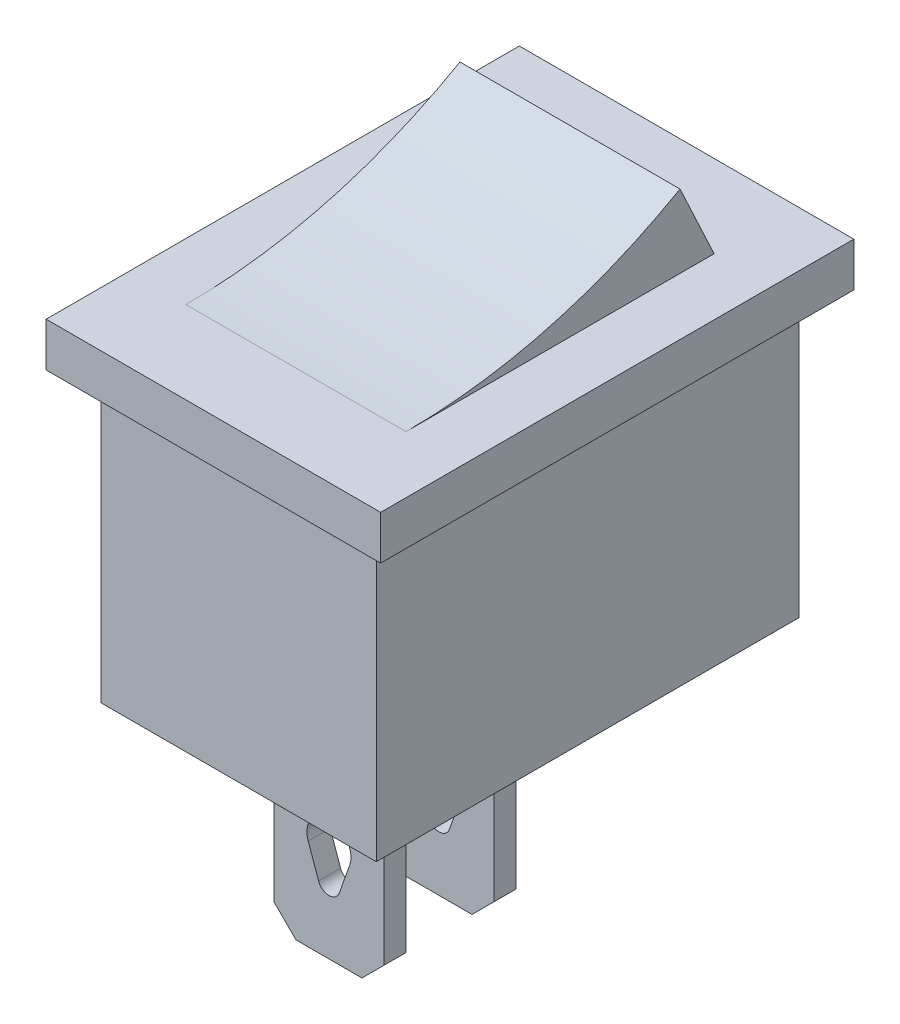
ISO-10303-21;
HEADER;
FILE_DESCRIPTION(('STEP AP214'),'2;1');
FILE_NAME('part.step','',(''),(''),'','','');
FILE_SCHEMA(('AUTOMOTIVE_DESIGN { 1 0 10303 214 1 1 1 1 }'));
ENDSEC;
DATA;
#1=APPLICATION_CONTEXT('core data for automotive mechanical design processes');
#2=APPLICATION_PROTOCOL_DEFINITION('international standard','automotive_design',2000,#1);
#3=PRODUCT_CONTEXT('',#1,'mechanical');
#4=PRODUCT('Part','Part','',(#3));
#5=PRODUCT_RELATED_PRODUCT_CATEGORY('part','',(#4));
#6=PRODUCT_DEFINITION_FORMATION('','',#4);
#7=PRODUCT_DEFINITION_CONTEXT('part definition',#1,'design');
#8=PRODUCT_DEFINITION('design','',#6,#7);
#9=PRODUCT_DEFINITION_SHAPE('','',#8);
#10=(LENGTH_UNIT() NAMED_UNIT(*) SI_UNIT(.MILLI.,.METRE.));
#11=(NAMED_UNIT(*) PLANE_ANGLE_UNIT() SI_UNIT($,.RADIAN.));
#12=(NAMED_UNIT(*) SI_UNIT($,.STERADIAN.) SOLID_ANGLE_UNIT());
#13=UNCERTAINTY_MEASURE_WITH_UNIT(LENGTH_MEASURE(1.E-05),#10,'distance_accuracy_value','');
#14=(GEOMETRIC_REPRESENTATION_CONTEXT(3) GLOBAL_UNCERTAINTY_ASSIGNED_CONTEXT((#13)) GLOBAL_UNIT_ASSIGNED_CONTEXT((#10,
#11,#12)) REPRESENTATION_CONTEXT('',''));
#15=CARTESIAN_POINT('',(0.,0.,0.));
#16=DIRECTION('',(0.,0.,1.));
#17=DIRECTION('',(1.,0.,0.));
#18=AXIS2_PLACEMENT_3D('',#15,#16,#17);
#19=CARTESIAN_POINT('',(0.,0.,0.));
#20=DIRECTION('',(0.,-1.,0.));
#21=DIRECTION('',(0.,0.,-1.));
#22=AXIS2_PLACEMENT_3D('',#19,#20,#21);
#23=PLANE('',#22);
#24=DIRECTION('',(0.,0.,-1.));
#25=VECTOR('',#24,1.);
#26=CARTESIAN_POINT('',(6.25,0.,9.6));
#27=LINE('',#26,#25);
#28=CARTESIAN_POINT('',(6.25,0.,9.6));
#29=VERTEX_POINT('',#28);
#30=CARTESIAN_POINT('',(6.25,0.,-9.6));
#31=VERTEX_POINT('',#30);
#32=EDGE_CURVE('E405',#29,#31,#27,.T.);
#33=ORIENTED_EDGE('',*,*,#32,.F.);
#34=DIRECTION('',(1.,0.,0.));
#35=VECTOR('',#34,1.);
#36=CARTESIAN_POINT('',(-6.25,0.,9.6));
#37=LINE('',#36,#35);
#38=CARTESIAN_POINT('',(-6.25,0.,9.6));
#39=VERTEX_POINT('',#38);
#40=EDGE_CURVE('E410',#39,#29,#37,.T.);
#41=ORIENTED_EDGE('',*,*,#40,.F.);
#42=DIRECTION('',(0.,0.,1.));
#43=VECTOR('',#42,1.);
#44=CARTESIAN_POINT('',(-6.25,0.,9.6));
#45=LINE('',#44,#43);
#46=CARTESIAN_POINT('',(-6.25,0.,-9.6));
#47=VERTEX_POINT('',#46);
#48=EDGE_CURVE('E424',#47,#39,#45,.T.);
#49=ORIENTED_EDGE('',*,*,#48,.F.);
#50=DIRECTION('',(-1.,0.,0.));
#51=VECTOR('',#50,1.);
#52=CARTESIAN_POINT('',(-6.25,0.,-9.6));
#53=LINE('',#52,#51);
#54=EDGE_CURVE('E422',#31,#47,#53,.T.);
#55=ORIENTED_EDGE('',*,*,#54,.F.);
#56=EDGE_LOOP('',(#33,#41,#49,#55));
#57=FACE_BOUND('',#56,.T.);
#58=DIRECTION('',(-1.,0.,0.));
#59=VECTOR('',#58,1.);
#60=CARTESIAN_POINT('',(-2.50000000000005,0.,5.5));
#61=LINE('',#60,#59);
#62=CARTESIAN_POINT('',(2.49999999999995,0.,5.5));
#63=VERTEX_POINT('',#62);
#64=CARTESIAN_POINT('',(-2.50000000000005,0.,5.5));
#65=VERTEX_POINT('',#64);
#66=EDGE_CURVE('E390',#63,#65,#61,.T.);
#67=ORIENTED_EDGE('',*,*,#66,.F.);
#68=DIRECTION('',(0.,0.,1.));
#69=VECTOR('',#68,1.);
#70=CARTESIAN_POINT('',(2.49999999999995,0.,4.5));
#71=LINE('',#70,#69);
#72=CARTESIAN_POINT('',(2.49999999999995,0.,4.5));
#73=VERTEX_POINT('',#72);
#74=EDGE_CURVE('E379',#73,#63,#71,.T.);
#75=ORIENTED_EDGE('',*,*,#74,.F.);
#76=DIRECTION('',(1.,0.,0.));
#77=VECTOR('',#76,1.);
#78=CARTESIAN_POINT('',(-2.50000000000005,0.,4.5));
#79=LINE('',#78,#77);
#80=CARTESIAN_POINT('',(-2.50000000000005,0.,4.5));
#81=VERTEX_POINT('',#80);
#82=EDGE_CURVE('E384',#81,#73,#79,.T.);
#83=ORIENTED_EDGE('',*,*,#82,.F.);
#84=DIRECTION('',(0.,0.,-1.));
#85=VECTOR('',#84,1.);
#86=CARTESIAN_POINT('',(-2.50000000000005,0.,4.5));
#87=LINE('',#86,#85);
#88=EDGE_CURVE('E393',#65,#81,#87,.T.);
#89=ORIENTED_EDGE('',*,*,#88,.F.);
#90=EDGE_LOOP('',(#67,#75,#83,#89));
#91=FACE_BOUND('',#90,.T.);
#92=DIRECTION('',(-1.,0.,0.));
#93=VECTOR('',#92,1.);
#94=CARTESIAN_POINT('',(-2.5,0.,0.500000000000001));
#95=LINE('',#94,#93);
#96=CARTESIAN_POINT('',(2.5,0.,0.500000000000001));
#97=VERTEX_POINT('',#96);
#98=CARTESIAN_POINT('',(-2.5,0.,0.500000000000001));
#99=VERTEX_POINT('',#98);
#100=EDGE_CURVE('E364',#97,#99,#95,.T.);
#101=ORIENTED_EDGE('',*,*,#100,.F.);
#102=DIRECTION('',(0.,0.,1.));
#103=VECTOR('',#102,1.);
#104=CARTESIAN_POINT('',(2.5,0.,-0.499999999999999));
#105=LINE('',#104,#103);
#106=CARTESIAN_POINT('',(2.5,0.,-0.499999999999999));
#107=VERTEX_POINT('',#106);
#108=EDGE_CURVE('E353',#107,#97,#105,.T.);
#109=ORIENTED_EDGE('',*,*,#108,.F.);
#110=DIRECTION('',(1.,0.,0.));
#111=VECTOR('',#110,1.);
#112=CARTESIAN_POINT('',(-2.5,0.,-0.5));
#113=LINE('',#112,#111);
#114=CARTESIAN_POINT('',(-2.5,0.,-0.5));
#115=VERTEX_POINT('',#114);
#116=EDGE_CURVE('E358',#115,#107,#113,.T.);
#117=ORIENTED_EDGE('',*,*,#116,.F.);
#118=DIRECTION('',(0.,0.,-1.));
#119=VECTOR('',#118,1.);
#120=CARTESIAN_POINT('',(-2.5,0.,-0.5));
#121=LINE('',#120,#119);
#122=EDGE_CURVE('E367',#99,#115,#121,.T.);
#123=ORIENTED_EDGE('',*,*,#122,.F.);
#124=EDGE_LOOP('',(#101,#109,#117,#123));
#125=FACE_BOUND('',#124,.T.);
#126=ADVANCED_FACE('F37',(#57,#91,#125),#23,.T.);
#127=CARTESIAN_POINT('',(6.25,13.,9.6));
#128=DIRECTION('',(-1.,0.,0.));
#129=DIRECTION('',(0.,0.,1.));
#130=AXIS2_PLACEMENT_3D('',#127,#128,#129);
#131=PLANE('',#130);
#132=ORIENTED_EDGE('',*,*,#32,.T.);
#133=DIRECTION('',(0.,-1.,0.));
#134=VECTOR('',#133,1.);
#135=CARTESIAN_POINT('',(6.25,13.,-9.6));
#136=LINE('',#135,#134);
#137=CARTESIAN_POINT('',(6.25,13.,-9.6));
#138=VERTEX_POINT('',#137);
#139=EDGE_CURVE('E435',#138,#31,#136,.T.);
#140=ORIENTED_EDGE('',*,*,#139,.F.);
#141=DIRECTION('',(0.,0.,-1.));
#142=VECTOR('',#141,1.);
#143=CARTESIAN_POINT('',(6.25,13.,9.6));
#144=LINE('',#143,#142);
#145=CARTESIAN_POINT('',(6.25,13.,9.6));
#146=VERTEX_POINT('',#145);
#147=EDGE_CURVE('E406',#146,#138,#144,.T.);
#148=ORIENTED_EDGE('',*,*,#147,.F.);
#149=DIRECTION('',(0.,-1.,0.));
#150=VECTOR('',#149,1.);
#151=CARTESIAN_POINT('',(6.25,13.,9.6));
#152=LINE('',#151,#150);
#153=EDGE_CURVE('E419',#146,#29,#152,.T.);
#154=ORIENTED_EDGE('',*,*,#153,.T.);
#155=EDGE_LOOP('',(#132,#140,#148,#154));
#156=FACE_BOUND('',#155,.T.);
#157=ADVANCED_FACE('F514',(#156),#131,.F.);
#158=CARTESIAN_POINT('',(-6.25,13.,-9.6));
#159=DIRECTION('',(0.,0.,1.));
#160=DIRECTION('',(1.,0.,0.));
#161=AXIS2_PLACEMENT_3D('',#158,#159,#160);
#162=PLANE('',#161);
#163=ORIENTED_EDGE('',*,*,#54,.T.);
#164=DIRECTION('',(0.,-1.,0.));
#165=VECTOR('',#164,1.);
#166=CARTESIAN_POINT('',(-6.25,13.,-9.6));
#167=LINE('',#166,#165);
#168=CARTESIAN_POINT('',(-6.25,13.,-9.6));
#169=VERTEX_POINT('',#168);
#170=EDGE_CURVE('E432',#169,#47,#167,.T.);
#171=ORIENTED_EDGE('',*,*,#170,.F.);
#172=DIRECTION('',(-1.,0.,0.));
#173=VECTOR('',#172,1.);
#174=CARTESIAN_POINT('',(-6.25,13.,-9.6));
#175=LINE('',#174,#173);
#176=EDGE_CURVE('E409',#138,#169,#175,.T.);
#177=ORIENTED_EDGE('',*,*,#176,.F.);
#178=ORIENTED_EDGE('',*,*,#139,.T.);
#179=EDGE_LOOP('',(#163,#171,#177,#178));
#180=FACE_BOUND('',#179,.T.);
#181=ADVANCED_FACE('F520',(#180),#162,.F.);
#182=CARTESIAN_POINT('',(-6.25,13.,9.6));
#183=DIRECTION('',(1.,0.,0.));
#184=DIRECTION('',(0.,0.,-1.));
#185=AXIS2_PLACEMENT_3D('',#182,#183,#184);
#186=PLANE('',#185);
#187=ORIENTED_EDGE('',*,*,#48,.T.);
#188=DIRECTION('',(0.,-1.,0.));
#189=VECTOR('',#188,1.);
#190=CARTESIAN_POINT('',(-6.25,13.,9.6));
#191=LINE('',#190,#189);
#192=CARTESIAN_POINT('',(-6.25,13.,9.6));
#193=VERTEX_POINT('',#192);
#194=EDGE_CURVE('E429',#193,#39,#191,.T.);
#195=ORIENTED_EDGE('',*,*,#194,.F.);
#196=DIRECTION('',(0.,0.,1.));
#197=VECTOR('',#196,1.);
#198=CARTESIAN_POINT('',(-6.25,13.,9.6));
#199=LINE('',#198,#197);
#200=EDGE_CURVE('E413',#169,#193,#199,.T.);
#201=ORIENTED_EDGE('',*,*,#200,.F.);
#202=ORIENTED_EDGE('',*,*,#170,.T.);
#203=EDGE_LOOP('',(#187,#195,#201,#202));
#204=FACE_BOUND('',#203,.T.);
#205=ADVANCED_FACE('F532',(#204),#186,.F.);
#206=CARTESIAN_POINT('',(-6.25,13.,9.6));
#207=DIRECTION('',(0.,0.,-1.));
#208=DIRECTION('',(-1.,0.,0.));
#209=AXIS2_PLACEMENT_3D('',#206,#207,#208);
#210=PLANE('',#209);
#211=ORIENTED_EDGE('',*,*,#40,.T.);
#212=ORIENTED_EDGE('',*,*,#153,.F.);
#213=DIRECTION('',(1.,0.,0.));
#214=VECTOR('',#213,1.);
#215=CARTESIAN_POINT('',(-6.25,13.,9.6));
#216=LINE('',#215,#214);
#217=EDGE_CURVE('E416',#193,#146,#216,.T.);
#218=ORIENTED_EDGE('',*,*,#217,.F.);
#219=ORIENTED_EDGE('',*,*,#194,.T.);
#220=EDGE_LOOP('',(#211,#212,#218,#219));
#221=FACE_BOUND('',#220,.T.);
#222=ADVANCED_FACE('F529',(#221),#210,.F.);
#223=CARTESIAN_POINT('',(2.49999999999995,-9.,4.5));
#224=DIRECTION('',(-1.,0.,0.));
#225=DIRECTION('',(0.,0.,1.));
#226=AXIS2_PLACEMENT_3D('',#223,#224,#225);
#227=PLANE('',#226);
#228=DIRECTION('',(0.,1.,0.));
#229=VECTOR('',#228,1.);
#230=CARTESIAN_POINT('',(2.49999999999995,-9.,5.5));
#231=LINE('',#230,#229);
#232=CARTESIAN_POINT('',(2.49999999999995,-8.,5.5));
#233=VERTEX_POINT('',#232);
#234=EDGE_CURVE('E403',#233,#63,#231,.T.);
#235=ORIENTED_EDGE('',*,*,#234,.F.);
#236=DIRECTION('',(0.,0.,-1.));
#237=VECTOR('',#236,1.);
#238=CARTESIAN_POINT('',(2.49999999999995,-8.,4.5));
#239=LINE('',#238,#237);
#240=CARTESIAN_POINT('',(2.49999999999995,-8.,4.5));
#241=VERTEX_POINT('',#240);
#242=EDGE_CURVE('E472',#233,#241,#239,.T.);
#243=ORIENTED_EDGE('',*,*,#242,.T.);
#244=DIRECTION('',(0.,1.,0.));
#245=VECTOR('',#244,1.);
#246=CARTESIAN_POINT('',(2.49999999999995,-9.,4.5));
#247=LINE('',#246,#245);
#248=EDGE_CURVE('E387',#241,#73,#247,.T.);
#249=ORIENTED_EDGE('',*,*,#248,.T.);
#250=ORIENTED_EDGE('',*,*,#74,.T.);
#251=EDGE_LOOP('',(#235,#243,#249,#250));
#252=FACE_BOUND('',#251,.T.);
#253=ADVANCED_FACE('F527',(#252),#227,.F.);
#254=CARTESIAN_POINT('',(-2.50000000000005,-9.,5.5));
#255=DIRECTION('',(0.,0.,-1.));
#256=DIRECTION('',(-1.,0.,0.));
#257=AXIS2_PLACEMENT_3D('',#254,#255,#256);
#258=PLANE('',#257);
#259=DIRECTION('',(-0.333333333333333,0.942809041582063,0.));
#260=VECTOR('',#259,1.);
#261=CARTESIAN_POINT('',(0.193626743013248,-8.04765913201493,5.5));
#262=LINE('',#261,#260);
#263=CARTESIAN_POINT('',(-0.471404520791032,-6.16666666666667,5.5));
#264=VERTEX_POINT('',#263);
#265=CARTESIAN_POINT('',(-0.942809041582064,-4.83333333333333,5.5));
#266=VERTEX_POINT('',#265);
#267=EDGE_CURVE('E341',#264,#266,#262,.T.);
#268=ORIENTED_EDGE('',*,*,#267,.T.);
#269=CARTESIAN_POINT('',(0.,-4.5,5.5));
#270=DIRECTION('',(0.,0.,-1.));
#271=DIRECTION('',(-1.,0.,0.));
#272=AXIS2_PLACEMENT_3D('',#269,#270,#271);
#273=CIRCLE('',#272,1.);
#274=CARTESIAN_POINT('',(0.942809041582063,-4.83333333333333,5.5));
#275=VERTEX_POINT('',#274);
#276=EDGE_CURVE('E350',#266,#275,#273,.T.);
#277=ORIENTED_EDGE('',*,*,#276,.T.);
#278=DIRECTION('',(-0.333333333333334,-0.942809041582063,0.));
#279=VECTOR('',#278,1.);
#280=CARTESIAN_POINT('',(-0.749182298568819,-9.61900753465173,5.5));
#281=LINE('',#280,#279);
#282=CARTESIAN_POINT('',(0.471404520791031,-6.16666666666667,5.5));
#283=VERTEX_POINT('',#282);
#284=EDGE_CURVE('E323',#275,#283,#281,.T.);
#285=ORIENTED_EDGE('',*,*,#284,.T.);
#286=CARTESIAN_POINT('',(0.,-6.,5.5));
#287=DIRECTION('',(0.,0.,-1.));
#288=DIRECTION('',(-1.,0.,0.));
#289=AXIS2_PLACEMENT_3D('',#286,#287,#288);
#290=CIRCLE('',#289,0.5);
#291=EDGE_CURVE('E332',#283,#264,#290,.T.);
#292=ORIENTED_EDGE('',*,*,#291,.T.);
#293=EDGE_LOOP('',(#268,#277,#285,#292));
#294=FACE_BOUND('',#293,.T.);
#295=DIRECTION('',(0.,1.,0.));
#296=VECTOR('',#295,1.);
#297=CARTESIAN_POINT('',(-2.50000000000005,-9.,5.5));
#298=LINE('',#297,#296);
#299=CARTESIAN_POINT('',(-2.50000000000005,-8.,5.5));
#300=VERTEX_POINT('',#299);
#301=EDGE_CURVE('E401',#300,#65,#298,.T.);
#302=ORIENTED_EDGE('',*,*,#301,.F.);
#303=DIRECTION('',(-0.707106781186548,0.707106781186548,0.));
#304=VECTOR('',#303,1.);
#305=CARTESIAN_POINT('',(-1.50000000000005,-9.,5.5));
#306=LINE('',#305,#304);
#307=CARTESIAN_POINT('',(-1.50000000000005,-9.,5.5));
#308=VERTEX_POINT('',#307);
#309=EDGE_CURVE('E470',#300,#308,#306,.F.);
#310=ORIENTED_EDGE('',*,*,#309,.T.);
#311=DIRECTION('',(-1.,0.,0.));
#312=VECTOR('',#311,1.);
#313=CARTESIAN_POINT('',(-2.50000000000005,-9.,5.5));
#314=LINE('',#313,#312);
#315=CARTESIAN_POINT('',(1.49999999999995,-9.,5.5));
#316=VERTEX_POINT('',#315);
#317=EDGE_CURVE('E380',#316,#308,#314,.T.);
#318=ORIENTED_EDGE('',*,*,#317,.F.);
#319=DIRECTION('',(-0.707106781186546,-0.707106781186549,0.));
#320=VECTOR('',#319,1.);
#321=CARTESIAN_POINT('',(1.49999999999995,-9.,5.5));
#322=LINE('',#321,#320);
#323=EDGE_CURVE('E468',#316,#233,#322,.F.);
#324=ORIENTED_EDGE('',*,*,#323,.T.);
#325=ORIENTED_EDGE('',*,*,#234,.T.);
#326=ORIENTED_EDGE('',*,*,#66,.T.);
#327=EDGE_LOOP('',(#302,#310,#318,#324,#325,#326));
#328=FACE_BOUND('',#327,.T.);
#329=ADVANCED_FACE('F567',(#294,#328),#258,.F.);
#330=CARTESIAN_POINT('',(-2.50000000000005,-9.,4.5));
#331=DIRECTION('',(1.,0.,0.));
#332=DIRECTION('',(0.,0.,-1.));
#333=AXIS2_PLACEMENT_3D('',#330,#331,#332);
#334=PLANE('',#333);
#335=DIRECTION('',(0.,1.,0.));
#336=VECTOR('',#335,1.);
#337=CARTESIAN_POINT('',(-2.50000000000005,-9.,4.5));
#338=LINE('',#337,#336);
#339=CARTESIAN_POINT('',(-2.50000000000005,-8.,4.5));
#340=VERTEX_POINT('',#339);
#341=EDGE_CURVE('E399',#340,#81,#338,.T.);
#342=ORIENTED_EDGE('',*,*,#341,.F.);
#343=DIRECTION('',(0.,0.,1.));
#344=VECTOR('',#343,1.);
#345=CARTESIAN_POINT('',(-2.50000000000005,-8.,4.5));
#346=LINE('',#345,#344);
#347=EDGE_CURVE('E466',#340,#300,#346,.T.);
#348=ORIENTED_EDGE('',*,*,#347,.T.);
#349=ORIENTED_EDGE('',*,*,#301,.T.);
#350=ORIENTED_EDGE('',*,*,#88,.T.);
#351=EDGE_LOOP('',(#342,#348,#349,#350));
#352=FACE_BOUND('',#351,.T.);
#353=ADVANCED_FACE('F584',(#352),#334,.F.);
#354=CARTESIAN_POINT('',(-2.50000000000005,-9.,4.5));
#355=DIRECTION('',(0.,0.,1.));
#356=DIRECTION('',(1.,0.,0.));
#357=AXIS2_PLACEMENT_3D('',#354,#355,#356);
#358=PLANE('',#357);
#359=DIRECTION('',(0.333333333333334,0.942809041582063,0.));
#360=VECTOR('',#359,1.);
#361=CARTESIAN_POINT('',(-0.749182298568819,-9.61900753465173,4.5));
#362=LINE('',#361,#360);
#363=CARTESIAN_POINT('',(0.471404520791031,-6.16666666666667,4.5));
#364=VERTEX_POINT('',#363);
#365=CARTESIAN_POINT('',(0.942809041582063,-4.83333333333333,4.5));
#366=VERTEX_POINT('',#365);
#367=EDGE_CURVE('E320',#364,#366,#362,.T.);
#368=ORIENTED_EDGE('',*,*,#367,.T.);
#369=CARTESIAN_POINT('',(0.,-4.5,4.5));
#370=DIRECTION('',(0.,0.,1.));
#371=DIRECTION('',(1.,0.,0.));
#372=AXIS2_PLACEMENT_3D('',#369,#370,#371);
#373=CIRCLE('',#372,1.);
#374=CARTESIAN_POINT('',(-0.942809041582063,-4.83333333333333,4.5));
#375=VERTEX_POINT('',#374);
#376=EDGE_CURVE('E347',#366,#375,#373,.T.);
#377=ORIENTED_EDGE('',*,*,#376,.T.);
#378=DIRECTION('',(0.333333333333333,-0.942809041582063,0.));
#379=VECTOR('',#378,1.);
#380=CARTESIAN_POINT('',(0.193626743013248,-8.04765913201493,4.5));
#381=LINE('',#380,#379);
#382=CARTESIAN_POINT('',(-0.471404520791032,-6.16666666666667,4.5));
#383=VERTEX_POINT('',#382);
#384=EDGE_CURVE('E338',#375,#383,#381,.T.);
#385=ORIENTED_EDGE('',*,*,#384,.T.);
#386=CARTESIAN_POINT('',(0.,-6.,4.5));
#387=DIRECTION('',(0.,0.,1.));
#388=DIRECTION('',(1.,0.,0.));
#389=AXIS2_PLACEMENT_3D('',#386,#387,#388);
#390=CIRCLE('',#389,0.5);
#391=EDGE_CURVE('E329',#383,#364,#390,.T.);
#392=ORIENTED_EDGE('',*,*,#391,.T.);
#393=EDGE_LOOP('',(#368,#377,#385,#392));
#394=FACE_BOUND('',#393,.T.);
#395=DIRECTION('',(1.,0.,0.));
#396=VECTOR('',#395,1.);
#397=CARTESIAN_POINT('',(-2.50000000000005,-9.,4.5));
#398=LINE('',#397,#396);
#399=CARTESIAN_POINT('',(-1.50000000000005,-9.,4.5));
#400=VERTEX_POINT('',#399);
#401=CARTESIAN_POINT('',(1.49999999999995,-9.,4.5));
#402=VERTEX_POINT('',#401);
#403=EDGE_CURVE('E383',#400,#402,#398,.T.);
#404=ORIENTED_EDGE('',*,*,#403,.F.);
#405=DIRECTION('',(0.707106781186548,-0.707106781186548,0.));
#406=VECTOR('',#405,1.);
#407=CARTESIAN_POINT('',(-1.50000000000005,-9.,4.5));
#408=LINE('',#407,#406);
#409=EDGE_CURVE('E464',#400,#340,#408,.F.);
#410=ORIENTED_EDGE('',*,*,#409,.T.);
#411=ORIENTED_EDGE('',*,*,#341,.T.);
#412=ORIENTED_EDGE('',*,*,#82,.T.);
#413=ORIENTED_EDGE('',*,*,#248,.F.);
#414=DIRECTION('',(0.707106781186546,0.707106781186549,0.));
#415=VECTOR('',#414,1.);
#416=CARTESIAN_POINT('',(1.49999999999995,-9.,4.5));
#417=LINE('',#416,#415);
#418=EDGE_CURVE('E462',#241,#402,#417,.F.);
#419=ORIENTED_EDGE('',*,*,#418,.T.);
#420=EDGE_LOOP('',(#404,#410,#411,#412,#413,#419));
#421=FACE_BOUND('',#420,.T.);
#422=ADVANCED_FACE('F586',(#394,#421),#358,.F.);
#423=CARTESIAN_POINT('',(0.,-9.,0.));
#424=DIRECTION('',(0.,1.,0.));
#425=DIRECTION('',(0.,0.,1.));
#426=AXIS2_PLACEMENT_3D('',#423,#424,#425);
#427=PLANE('',#426);
#428=ORIENTED_EDGE('',*,*,#317,.T.);
#429=DIRECTION('',(0.,0.,-1.));
#430=VECTOR('',#429,1.);
#431=CARTESIAN_POINT('',(-1.50000000000005,-9.,0.));
#432=LINE('',#431,#430);
#433=EDGE_CURVE('E459',#308,#400,#432,.T.);
#434=ORIENTED_EDGE('',*,*,#433,.T.);
#435=ORIENTED_EDGE('',*,*,#403,.T.);
#436=DIRECTION('',(0.,0.,1.));
#437=VECTOR('',#436,1.);
#438=CARTESIAN_POINT('',(1.49999999999995,-9.,0.));
#439=LINE('',#438,#437);
#440=EDGE_CURVE('E456',#402,#316,#439,.T.);
#441=ORIENTED_EDGE('',*,*,#440,.T.);
#442=EDGE_LOOP('',(#428,#434,#435,#441));
#443=FACE_BOUND('',#442,.T.);
#444=ADVANCED_FACE('F569',(#443),#427,.F.);
#445=CARTESIAN_POINT('',(2.5,-9.,-0.499999999999999));
#446=DIRECTION('',(-1.,0.,0.));
#447=DIRECTION('',(0.,0.,1.));
#448=AXIS2_PLACEMENT_3D('',#445,#446,#447);
#449=PLANE('',#448);
#450=DIRECTION('',(0.,1.,0.));
#451=VECTOR('',#450,1.);
#452=CARTESIAN_POINT('',(2.5,-9.,0.500000000000001));
#453=LINE('',#452,#451);
#454=CARTESIAN_POINT('',(2.5,-8.,0.500000000000001));
#455=VERTEX_POINT('',#454);
#456=EDGE_CURVE('E377',#455,#97,#453,.T.);
#457=ORIENTED_EDGE('',*,*,#456,.F.);
#458=DIRECTION('',(0.,0.,-1.));
#459=VECTOR('',#458,1.);
#460=CARTESIAN_POINT('',(2.5,-8.,-0.499999999999999));
#461=LINE('',#460,#459);
#462=CARTESIAN_POINT('',(2.5,-8.,-0.499999999999999));
#463=VERTEX_POINT('',#462);
#464=EDGE_CURVE('E448',#455,#463,#461,.T.);
#465=ORIENTED_EDGE('',*,*,#464,.T.);
#466=DIRECTION('',(0.,1.,0.));
#467=VECTOR('',#466,1.);
#468=CARTESIAN_POINT('',(2.5,-9.,-0.499999999999999));
#469=LINE('',#468,#467);
#470=EDGE_CURVE('E361',#463,#107,#469,.T.);
#471=ORIENTED_EDGE('',*,*,#470,.T.);
#472=ORIENTED_EDGE('',*,*,#108,.T.);
#473=EDGE_LOOP('',(#457,#465,#471,#472));
#474=FACE_BOUND('',#473,.T.);
#475=ADVANCED_FACE('F594',(#474),#449,.F.);
#476=CARTESIAN_POINT('',(-2.5,-9.,0.500000000000001));
#477=DIRECTION('',(0.,0.,-1.));
#478=DIRECTION('',(-1.,0.,0.));
#479=AXIS2_PLACEMENT_3D('',#476,#477,#478);
#480=PLANE('',#479);
#481=DIRECTION('',(-0.333333333333333,0.942809041582063,0.));
#482=VECTOR('',#481,1.);
#483=CARTESIAN_POINT('',(0.193626743013254,-8.04765913201495,0.500000000000001));
#484=LINE('',#483,#482);
#485=CARTESIAN_POINT('',(-0.471404520791032,-6.16666666666667,0.5));
#486=VERTEX_POINT('',#485);
#487=CARTESIAN_POINT('',(-0.942809041582063,-4.83333333333333,0.5));
#488=VERTEX_POINT('',#487);
#489=EDGE_CURVE('E335',#486,#488,#484,.T.);
#490=ORIENTED_EDGE('',*,*,#489,.T.);
#491=CARTESIAN_POINT('',(0.,-4.5,0.5));
#492=DIRECTION('',(0.,0.,-1.));
#493=DIRECTION('',(-1.,0.,0.));
#494=AXIS2_PLACEMENT_3D('',#491,#492,#493);
#495=CIRCLE('',#494,1.);
#496=CARTESIAN_POINT('',(0.942809041582064,-4.83333333333333,0.5));
#497=VERTEX_POINT('',#496);
#498=EDGE_CURVE('E344',#488,#497,#495,.T.);
#499=ORIENTED_EDGE('',*,*,#498,.T.);
#500=DIRECTION('',(-0.333333333333334,-0.942809041582063,0.));
#501=VECTOR('',#500,1.);
#502=CARTESIAN_POINT('',(-0.749182298568813,-9.61900753465172,0.500000000000001));
#503=LINE('',#502,#501);
#504=CARTESIAN_POINT('',(0.471404520791032,-6.16666666666667,0.500000000000001));
#505=VERTEX_POINT('',#504);
#506=EDGE_CURVE('E317',#497,#505,#503,.T.);
#507=ORIENTED_EDGE('',*,*,#506,.T.);
#508=CARTESIAN_POINT('',(0.,-6.,0.5));
#509=DIRECTION('',(0.,0.,-1.));
#510=DIRECTION('',(-1.,0.,0.));
#511=AXIS2_PLACEMENT_3D('',#508,#509,#510);
#512=CIRCLE('',#511,0.5);
#513=EDGE_CURVE('E326',#505,#486,#512,.T.);
#514=ORIENTED_EDGE('',*,*,#513,.T.);
#515=EDGE_LOOP('',(#490,#499,#507,#514));
#516=FACE_BOUND('',#515,.T.);
#517=DIRECTION('',(-1.,0.,0.));
#518=VECTOR('',#517,1.);
#519=CARTESIAN_POINT('',(-2.5,-9.,0.500000000000001));
#520=LINE('',#519,#518);
#521=CARTESIAN_POINT('',(1.5,-9.,0.500000000000001));
#522=VERTEX_POINT('',#521);
#523=CARTESIAN_POINT('',(-1.5,-9.,0.500000000000001));
#524=VERTEX_POINT('',#523);
#525=EDGE_CURVE('E354',#522,#524,#520,.T.);
#526=ORIENTED_EDGE('',*,*,#525,.F.);
#527=DIRECTION('',(-0.707106781186548,-0.707106781186548,0.));
#528=VECTOR('',#527,1.);
#529=CARTESIAN_POINT('',(1.5,-9.,0.500000000000001));
#530=LINE('',#529,#528);
#531=EDGE_CURVE('E446',#522,#455,#530,.F.);
#532=ORIENTED_EDGE('',*,*,#531,.T.);
#533=ORIENTED_EDGE('',*,*,#456,.T.);
#534=ORIENTED_EDGE('',*,*,#100,.T.);
#535=DIRECTION('',(0.,1.,0.));
#536=VECTOR('',#535,1.);
#537=CARTESIAN_POINT('',(-2.5,-9.,0.500000000000001));
#538=LINE('',#537,#536);
#539=CARTESIAN_POINT('',(-2.5,-8.,0.500000000000001));
#540=VERTEX_POINT('',#539);
#541=EDGE_CURVE('E375',#540,#99,#538,.T.);
#542=ORIENTED_EDGE('',*,*,#541,.F.);
#543=DIRECTION('',(-0.707106781186548,0.707106781186548,0.));
#544=VECTOR('',#543,1.);
#545=CARTESIAN_POINT('',(-1.5,-9.,0.500000000000001));
#546=LINE('',#545,#544);
#547=EDGE_CURVE('E444',#540,#524,#546,.F.);
#548=ORIENTED_EDGE('',*,*,#547,.T.);
#549=EDGE_LOOP('',(#526,#532,#533,#534,#542,#548));
#550=FACE_BOUND('',#549,.T.);
#551=ADVANCED_FACE('F492',(#516,#550),#480,.F.);
#552=CARTESIAN_POINT('',(-2.5,-9.,-0.5));
#553=DIRECTION('',(1.,0.,0.));
#554=DIRECTION('',(0.,0.,-1.));
#555=AXIS2_PLACEMENT_3D('',#552,#553,#554);
#556=PLANE('',#555);
#557=DIRECTION('',(0.,1.,0.));
#558=VECTOR('',#557,1.);
#559=CARTESIAN_POINT('',(-2.5,-9.,-0.5));
#560=LINE('',#559,#558);
#561=CARTESIAN_POINT('',(-2.5,-8.,-0.5));
#562=VERTEX_POINT('',#561);
#563=EDGE_CURVE('E373',#562,#115,#560,.T.);
#564=ORIENTED_EDGE('',*,*,#563,.F.);
#565=DIRECTION('',(0.,0.,1.));
#566=VECTOR('',#565,1.);
#567=CARTESIAN_POINT('',(-2.5,-8.,-0.5));
#568=LINE('',#567,#566);
#569=EDGE_CURVE('E454',#562,#540,#568,.T.);
#570=ORIENTED_EDGE('',*,*,#569,.T.);
#571=ORIENTED_EDGE('',*,*,#541,.T.);
#572=ORIENTED_EDGE('',*,*,#122,.T.);
#573=EDGE_LOOP('',(#564,#570,#571,#572));
#574=FACE_BOUND('',#573,.T.);
#575=ADVANCED_FACE('F626',(#574),#556,.F.);
#576=CARTESIAN_POINT('',(-2.5,-9.,-0.5));
#577=DIRECTION('',(0.,0.,1.));
#578=DIRECTION('',(1.,0.,0.));
#579=AXIS2_PLACEMENT_3D('',#576,#577,#578);
#580=PLANE('',#579);
#581=DIRECTION('',(0.333333333333334,0.942809041582063,0.));
#582=VECTOR('',#581,1.);
#583=CARTESIAN_POINT('',(-0.749182298568813,-9.61900753465172,-0.499999999999999));
#584=LINE('',#583,#582);
#585=CARTESIAN_POINT('',(0.471404520791032,-6.16666666666667,-0.499999999999999));
#586=VERTEX_POINT('',#585);
#587=CARTESIAN_POINT('',(0.942809041582064,-4.83333333333333,-0.499999999999999));
#588=VERTEX_POINT('',#587);
#589=EDGE_CURVE('E474',#586,#588,#584,.T.);
#590=ORIENTED_EDGE('',*,*,#589,.T.);
#591=CARTESIAN_POINT('',(0.,-4.5,-0.5));
#592=DIRECTION('',(0.,0.,1.));
#593=DIRECTION('',(1.,0.,0.));
#594=AXIS2_PLACEMENT_3D('',#591,#592,#593);
#595=CIRCLE('',#594,1.);
#596=CARTESIAN_POINT('',(-0.942809041582063,-4.83333333333333,-0.499999999999999));
#597=VERTEX_POINT('',#596);
#598=EDGE_CURVE('E11',#588,#597,#595,.T.);
#599=ORIENTED_EDGE('',*,*,#598,.T.);
#600=DIRECTION('',(0.333333333333333,-0.942809041582063,0.));
#601=VECTOR('',#600,1.);
#602=CARTESIAN_POINT('',(0.193626743013254,-8.04765913201495,-0.499999999999999));
#603=LINE('',#602,#601);
#604=CARTESIAN_POINT('',(-0.471404520791031,-6.16666666666667,-0.5));
#605=VERTEX_POINT('',#604);
#606=EDGE_CURVE('E46',#597,#605,#603,.T.);
#607=ORIENTED_EDGE('',*,*,#606,.T.);
#608=CARTESIAN_POINT('',(0.,-6.,-0.5));
#609=DIRECTION('',(0.,0.,1.));
#610=DIRECTION('',(1.,0.,0.));
#611=AXIS2_PLACEMENT_3D('',#608,#609,#610);
#612=CIRCLE('',#611,0.5);
#613=EDGE_CURVE('E477',#605,#586,#612,.T.);
#614=ORIENTED_EDGE('',*,*,#613,.T.);
#615=EDGE_LOOP('',(#590,#599,#607,#614));
#616=FACE_BOUND('',#615,.T.);
#617=ORIENTED_EDGE('',*,*,#470,.F.);
#618=DIRECTION('',(0.707106781186548,0.707106781186548,0.));
#619=VECTOR('',#618,1.);
#620=CARTESIAN_POINT('',(1.5,-9.,-0.499999999999999));
#621=LINE('',#620,#619);
#622=CARTESIAN_POINT('',(1.5,-9.,-0.499999999999999));
#623=VERTEX_POINT('',#622);
#624=EDGE_CURVE('E452',#463,#623,#621,.F.);
#625=ORIENTED_EDGE('',*,*,#624,.T.);
#626=DIRECTION('',(1.,0.,0.));
#627=VECTOR('',#626,1.);
#628=CARTESIAN_POINT('',(-2.5,-9.,-0.5));
#629=LINE('',#628,#627);
#630=CARTESIAN_POINT('',(-1.5,-9.,-0.499999999999999));
#631=VERTEX_POINT('',#630);
#632=EDGE_CURVE('E357',#631,#623,#629,.T.);
#633=ORIENTED_EDGE('',*,*,#632,.F.);
#634=DIRECTION('',(0.707106781186548,-0.707106781186548,0.));
#635=VECTOR('',#634,1.);
#636=CARTESIAN_POINT('',(-1.5,-9.,-0.499999999999999));
#637=LINE('',#636,#635);
#638=EDGE_CURVE('E450',#631,#562,#637,.F.);
#639=ORIENTED_EDGE('',*,*,#638,.T.);
#640=ORIENTED_EDGE('',*,*,#563,.T.);
#641=ORIENTED_EDGE('',*,*,#116,.T.);
#642=EDGE_LOOP('',(#617,#625,#633,#639,#640,#641));
#643=FACE_BOUND('',#642,.T.);
#644=ADVANCED_FACE('F481',(#616,#643),#580,.F.);
#645=CARTESIAN_POINT('',(0.,-9.,0.));
#646=DIRECTION('',(0.,1.,0.));
#647=DIRECTION('',(0.,0.,1.));
#648=AXIS2_PLACEMENT_3D('',#645,#646,#647);
#649=PLANE('',#648);
#650=ORIENTED_EDGE('',*,*,#632,.T.);
#651=DIRECTION('',(0.,0.,1.));
#652=VECTOR('',#651,1.);
#653=CARTESIAN_POINT('',(1.5,-9.,0.));
#654=LINE('',#653,#652);
#655=EDGE_CURVE('E441',#623,#522,#654,.T.);
#656=ORIENTED_EDGE('',*,*,#655,.T.);
#657=ORIENTED_EDGE('',*,*,#525,.T.);
#658=DIRECTION('',(0.,0.,-1.));
#659=VECTOR('',#658,1.);
#660=CARTESIAN_POINT('',(-1.5,-9.,0.));
#661=LINE('',#660,#659);
#662=EDGE_CURVE('E438',#524,#631,#661,.T.);
#663=ORIENTED_EDGE('',*,*,#662,.T.);
#664=EDGE_LOOP('',(#650,#656,#657,#663));
#665=FACE_BOUND('',#664,.T.);
#666=ADVANCED_FACE('F548',(#665),#649,.F.);
#667=CARTESIAN_POINT('',(1.5,-9.,0.));
#668=DIRECTION('',(-0.707106781186547,0.707106781186547,0.));
#669=DIRECTION('',(0.,0.,1.));
#670=AXIS2_PLACEMENT_3D('',#667,#668,#669);
#671=PLANE('',#670);
#672=ORIENTED_EDGE('',*,*,#624,.F.);
#673=ORIENTED_EDGE('',*,*,#464,.F.);
#674=ORIENTED_EDGE('',*,*,#531,.F.);
#675=ORIENTED_EDGE('',*,*,#655,.F.);
#676=EDGE_LOOP('',(#672,#673,#674,#675));
#677=FACE_BOUND('',#676,.T.);
#678=ADVANCED_FACE('F541',(#677),#671,.F.);
#679=CARTESIAN_POINT('',(-1.5,-9.,0.));
#680=DIRECTION('',(0.707106781186547,0.707106781186547,0.));
#681=DIRECTION('',(0.,0.,-1.));
#682=AXIS2_PLACEMENT_3D('',#679,#680,#681);
#683=PLANE('',#682);
#684=ORIENTED_EDGE('',*,*,#547,.F.);
#685=ORIENTED_EDGE('',*,*,#569,.F.);
#686=ORIENTED_EDGE('',*,*,#638,.F.);
#687=ORIENTED_EDGE('',*,*,#662,.F.);
#688=EDGE_LOOP('',(#684,#685,#686,#687));
#689=FACE_BOUND('',#688,.T.);
#690=ADVANCED_FACE('F547',(#689),#683,.F.);
#691=CARTESIAN_POINT('',(-1.50000000000005,-9.,0.));
#692=DIRECTION('',(0.707106781186547,0.707106781186547,0.));
#693=DIRECTION('',(0.,0.,-1.));
#694=AXIS2_PLACEMENT_3D('',#691,#692,#693);
#695=PLANE('',#694);
#696=ORIENTED_EDGE('',*,*,#309,.F.);
#697=ORIENTED_EDGE('',*,*,#347,.F.);
#698=ORIENTED_EDGE('',*,*,#409,.F.);
#699=ORIENTED_EDGE('',*,*,#433,.F.);
#700=EDGE_LOOP('',(#696,#697,#698,#699));
#701=FACE_BOUND('',#700,.T.);
#702=ADVANCED_FACE('F508',(#701),#695,.F.);
#703=CARTESIAN_POINT('',(1.49999999999995,-9.,0.));
#704=DIRECTION('',(-0.707106781186549,0.707106781186546,0.));
#705=DIRECTION('',(0.,0.,1.));
#706=AXIS2_PLACEMENT_3D('',#703,#704,#705);
#707=PLANE('',#706);
#708=ORIENTED_EDGE('',*,*,#418,.F.);
#709=ORIENTED_EDGE('',*,*,#242,.F.);
#710=ORIENTED_EDGE('',*,*,#323,.F.);
#711=ORIENTED_EDGE('',*,*,#440,.F.);
#712=EDGE_LOOP('',(#708,#709,#710,#711));
#713=FACE_BOUND('',#712,.T.);
#714=ADVANCED_FACE('F40',(#713),#707,.F.);
#715=CARTESIAN_POINT('',(0.471404520791031,-6.16666666666667,9.6));
#716=DIRECTION('',(0.942809041582063,-0.333333333333334,0.));
#717=DIRECTION('',(0.333333333333334,0.942809041582063,0.));
#718=AXIS2_PLACEMENT_3D('',#715,#716,#717);
#719=PLANE('',#718);
#720=DIRECTION('',(0.,0.,-1.));
#721=VECTOR('',#720,1.);
#722=CARTESIAN_POINT('',(0.942809041582063,-4.83333333333333,9.6));
#723=LINE('',#722,#721);
#724=EDGE_CURVE('E303',#497,#588,#723,.T.);
#725=ORIENTED_EDGE('',*,*,#724,.T.);
#726=ORIENTED_EDGE('',*,*,#589,.F.);
#727=DIRECTION('',(0.,0.,-1.));
#728=VECTOR('',#727,1.);
#729=CARTESIAN_POINT('',(0.471404520791031,-6.16666666666667,9.6));
#730=LINE('',#729,#728);
#731=EDGE_CURVE('E312',#505,#586,#730,.T.);
#732=ORIENTED_EDGE('',*,*,#731,.F.);
#733=ORIENTED_EDGE('',*,*,#506,.F.);
#734=EDGE_LOOP('',(#725,#726,#732,#733));
#735=FACE_BOUND('',#734,.T.);
#736=ADVANCED_FACE('F498',(#735),#719,.F.);
#737=CARTESIAN_POINT('',(0.,-6.,9.6));
#738=DIRECTION('',(0.,0.,-1.));
#739=DIRECTION('',(-1.,0.,0.));
#740=AXIS2_PLACEMENT_3D('',#737,#738,#739);
#741=CYLINDRICAL_SURFACE('',#740,0.5);
#742=ORIENTED_EDGE('',*,*,#731,.T.);
#743=ORIENTED_EDGE('',*,*,#613,.F.);
#744=DIRECTION('',(0.,0.,-1.));
#745=VECTOR('',#744,1.);
#746=CARTESIAN_POINT('',(-0.471404520791032,-6.16666666666667,9.6));
#747=LINE('',#746,#745);
#748=EDGE_CURVE('E309',#486,#605,#747,.T.);
#749=ORIENTED_EDGE('',*,*,#748,.F.);
#750=ORIENTED_EDGE('',*,*,#513,.F.);
#751=EDGE_LOOP('',(#742,#743,#749,#750));
#752=FACE_BOUND('',#751,.T.);
#753=ADVANCED_FACE('F496',(#752),#741,.F.);
#754=CARTESIAN_POINT('',(-0.942809041582064,-4.83333333333333,9.6));
#755=DIRECTION('',(-0.942809041582063,-0.333333333333333,0.));
#756=DIRECTION('',(0.333333333333333,-0.942809041582063,0.));
#757=AXIS2_PLACEMENT_3D('',#754,#755,#756);
#758=PLANE('',#757);
#759=ORIENTED_EDGE('',*,*,#748,.T.);
#760=ORIENTED_EDGE('',*,*,#606,.F.);
#761=DIRECTION('',(0.,0.,-1.));
#762=VECTOR('',#761,1.);
#763=CARTESIAN_POINT('',(-0.942809041582064,-4.83333333333333,9.6));
#764=LINE('',#763,#762);
#765=EDGE_CURVE('E304',#488,#597,#764,.T.);
#766=ORIENTED_EDGE('',*,*,#765,.F.);
#767=ORIENTED_EDGE('',*,*,#489,.F.);
#768=EDGE_LOOP('',(#759,#760,#766,#767));
#769=FACE_BOUND('',#768,.T.);
#770=ADVANCED_FACE('F486',(#769),#758,.F.);
#771=CARTESIAN_POINT('',(0.,-4.5,9.6));
#772=DIRECTION('',(0.,0.,-1.));
#773=DIRECTION('',(-1.,0.,0.));
#774=AXIS2_PLACEMENT_3D('',#771,#772,#773);
#775=CYLINDRICAL_SURFACE('',#774,1.);
#776=ORIENTED_EDGE('',*,*,#765,.T.);
#777=ORIENTED_EDGE('',*,*,#598,.F.);
#778=ORIENTED_EDGE('',*,*,#724,.F.);
#779=ORIENTED_EDGE('',*,*,#498,.F.);
#780=EDGE_LOOP('',(#776,#777,#778,#779));
#781=FACE_BOUND('',#780,.T.);
#782=ADVANCED_FACE('F489',(#781),#775,.F.);
#783=EDGE_CURVE('E307',#266,#375,#764,.T.);
#784=ORIENTED_EDGE('',*,*,#783,.T.);
#785=ORIENTED_EDGE('',*,*,#376,.F.);
#786=EDGE_CURVE('E315',#275,#366,#723,.T.);
#787=ORIENTED_EDGE('',*,*,#786,.F.);
#788=ORIENTED_EDGE('',*,*,#276,.F.);
#789=EDGE_LOOP('',(#784,#785,#787,#788));
#790=FACE_BOUND('',#789,.T.);
#791=ADVANCED_FACE('F612',(#790),#775,.F.);
#792=EDGE_CURVE('E308',#264,#383,#747,.T.);
#793=ORIENTED_EDGE('',*,*,#792,.T.);
#794=ORIENTED_EDGE('',*,*,#384,.F.);
#795=ORIENTED_EDGE('',*,*,#783,.F.);
#796=ORIENTED_EDGE('',*,*,#267,.F.);
#797=EDGE_LOOP('',(#793,#794,#795,#796));
#798=FACE_BOUND('',#797,.T.);
#799=ADVANCED_FACE('F607',(#798),#758,.F.);
#800=EDGE_CURVE('E61',#283,#364,#730,.T.);
#801=ORIENTED_EDGE('',*,*,#800,.T.);
#802=ORIENTED_EDGE('',*,*,#391,.F.);
#803=ORIENTED_EDGE('',*,*,#792,.F.);
#804=ORIENTED_EDGE('',*,*,#291,.F.);
#805=EDGE_LOOP('',(#801,#802,#803,#804));
#806=FACE_BOUND('',#805,.T.);
#807=ADVANCED_FACE('F507',(#806),#741,.F.);
#808=ORIENTED_EDGE('',*,*,#786,.T.);
#809=ORIENTED_EDGE('',*,*,#367,.F.);
#810=ORIENTED_EDGE('',*,*,#800,.F.);
#811=ORIENTED_EDGE('',*,*,#284,.F.);
#812=EDGE_LOOP('',(#808,#809,#810,#811));
#813=FACE_BOUND('',#812,.T.);
#814=ADVANCED_FACE('F501',(#813),#719,.F.);
#815=CARTESIAN_POINT('',(0.,13.,0.));
#816=DIRECTION('',(0.,1.,0.));
#817=DIRECTION('',(0.,0.,1.));
#818=AXIS2_PLACEMENT_3D('',#815,#816,#817);
#819=PLANE('',#818);
#820=DIRECTION('',(0.,0.,1.));
#821=VECTOR('',#820,1.);
#822=CARTESIAN_POINT('',(-7.6,13.,10.75));
#823=LINE('',#822,#821);
#824=CARTESIAN_POINT('',(-7.6,13.,-10.75));
#825=VERTEX_POINT('',#824);
#826=CARTESIAN_POINT('',(-7.6,13.,10.75));
#827=VERTEX_POINT('',#826);
#828=EDGE_CURVE('E258',#825,#827,#823,.T.);
#829=ORIENTED_EDGE('',*,*,#828,.F.);
#830=DIRECTION('',(-1.,0.,0.));
#831=VECTOR('',#830,1.);
#832=CARTESIAN_POINT('',(7.6,13.,-10.75));
#833=LINE('',#832,#831);
#834=CARTESIAN_POINT('',(7.6,13.,-10.75));
#835=VERTEX_POINT('',#834);
#836=EDGE_CURVE('E278',#835,#825,#833,.T.);
#837=ORIENTED_EDGE('',*,*,#836,.F.);
#838=DIRECTION('',(0.,0.,-1.));
#839=VECTOR('',#838,1.);
#840=CARTESIAN_POINT('',(7.6,13.,10.75));
#841=LINE('',#840,#839);
#842=CARTESIAN_POINT('',(7.6,13.,10.75));
#843=VERTEX_POINT('',#842);
#844=EDGE_CURVE('E289',#843,#835,#841,.T.);
#845=ORIENTED_EDGE('',*,*,#844,.F.);
#846=DIRECTION('',(1.,0.,0.));
#847=VECTOR('',#846,1.);
#848=CARTESIAN_POINT('',(7.6,13.,10.75));
#849=LINE('',#848,#847);
#850=EDGE_CURVE('E287',#827,#843,#849,.T.);
#851=ORIENTED_EDGE('',*,*,#850,.F.);
#852=EDGE_LOOP('',(#829,#837,#845,#851));
#853=FACE_BOUND('',#852,.T.);
#854=ORIENTED_EDGE('',*,*,#217,.T.);
#855=ORIENTED_EDGE('',*,*,#147,.T.);
#856=ORIENTED_EDGE('',*,*,#176,.T.);
#857=ORIENTED_EDGE('',*,*,#200,.T.);
#858=EDGE_LOOP('',(#854,#855,#856,#857));
#859=FACE_BOUND('',#858,.T.);
#860=ADVANCED_FACE('F512',(#853,#859),#819,.F.);
#861=CARTESIAN_POINT('',(-7.6,15.,10.75));
#862=DIRECTION('',(1.,0.,0.));
#863=DIRECTION('',(0.,0.,-1.));
#864=AXIS2_PLACEMENT_3D('',#861,#862,#863);
#865=PLANE('',#864);
#866=ORIENTED_EDGE('',*,*,#828,.T.);
#867=DIRECTION('',(0.,-1.,0.));
#868=VECTOR('',#867,1.);
#869=CARTESIAN_POINT('',(-7.6,15.,10.75));
#870=LINE('',#869,#868);
#871=CARTESIAN_POINT('',(-7.6,15.,10.75));
#872=VERTEX_POINT('',#871);
#873=EDGE_CURVE('E300',#872,#827,#870,.T.);
#874=ORIENTED_EDGE('',*,*,#873,.F.);
#875=DIRECTION('',(0.,0.,1.));
#876=VECTOR('',#875,1.);
#877=CARTESIAN_POINT('',(-7.6,15.,10.75));
#878=LINE('',#877,#876);
#879=CARTESIAN_POINT('',(-7.6,15.,-10.75));
#880=VERTEX_POINT('',#879);
#881=EDGE_CURVE('E274',#880,#872,#878,.T.);
#882=ORIENTED_EDGE('',*,*,#881,.F.);
#883=DIRECTION('',(0.,-1.,0.));
#884=VECTOR('',#883,1.);
#885=CARTESIAN_POINT('',(-7.6,15.,-10.75));
#886=LINE('',#885,#884);
#887=EDGE_CURVE('E284',#880,#825,#886,.T.);
#888=ORIENTED_EDGE('',*,*,#887,.T.);
#889=EDGE_LOOP('',(#866,#874,#882,#888));
#890=FACE_BOUND('',#889,.T.);
#891=ADVANCED_FACE('F802',(#890),#865,.F.);
#892=CARTESIAN_POINT('',(7.6,15.,10.75));
#893=DIRECTION('',(0.,0.,-1.));
#894=DIRECTION('',(-1.,0.,0.));
#895=AXIS2_PLACEMENT_3D('',#892,#893,#894);
#896=PLANE('',#895);
#897=ORIENTED_EDGE('',*,*,#850,.T.);
#898=DIRECTION('',(0.,-1.,0.));
#899=VECTOR('',#898,1.);
#900=CARTESIAN_POINT('',(7.6,15.,10.75));
#901=LINE('',#900,#899);
#902=CARTESIAN_POINT('',(7.6,15.,10.75));
#903=VERTEX_POINT('',#902);
#904=EDGE_CURVE('E297',#903,#843,#901,.T.);
#905=ORIENTED_EDGE('',*,*,#904,.F.);
#906=DIRECTION('',(1.,0.,0.));
#907=VECTOR('',#906,1.);
#908=CARTESIAN_POINT('',(7.6,15.,10.75));
#909=LINE('',#908,#907);
#910=EDGE_CURVE('E277',#872,#903,#909,.T.);
#911=ORIENTED_EDGE('',*,*,#910,.F.);
#912=ORIENTED_EDGE('',*,*,#873,.T.);
#913=EDGE_LOOP('',(#897,#905,#911,#912));
#914=FACE_BOUND('',#913,.T.);
#915=ADVANCED_FACE('F805',(#914),#896,.F.);
#916=CARTESIAN_POINT('',(7.6,15.,10.75));
#917=DIRECTION('',(-1.,0.,0.));
#918=DIRECTION('',(0.,0.,1.));
#919=AXIS2_PLACEMENT_3D('',#916,#917,#918);
#920=PLANE('',#919);
#921=ORIENTED_EDGE('',*,*,#844,.T.);
#922=DIRECTION('',(0.,-1.,0.));
#923=VECTOR('',#922,1.);
#924=CARTESIAN_POINT('',(7.6,15.,-10.75));
#925=LINE('',#924,#923);
#926=CARTESIAN_POINT('',(7.6,15.,-10.75));
#927=VERTEX_POINT('',#926);
#928=EDGE_CURVE('E294',#927,#835,#925,.T.);
#929=ORIENTED_EDGE('',*,*,#928,.F.);
#930=DIRECTION('',(0.,0.,-1.));
#931=VECTOR('',#930,1.);
#932=CARTESIAN_POINT('',(7.6,15.,10.75));
#933=LINE('',#932,#931);
#934=EDGE_CURVE('E280',#903,#927,#933,.T.);
#935=ORIENTED_EDGE('',*,*,#934,.F.);
#936=ORIENTED_EDGE('',*,*,#904,.T.);
#937=EDGE_LOOP('',(#921,#929,#935,#936));
#938=FACE_BOUND('',#937,.T.);
#939=ADVANCED_FACE('F809',(#938),#920,.F.);
#940=CARTESIAN_POINT('',(7.6,15.,-10.75));
#941=DIRECTION('',(0.,0.,1.));
#942=DIRECTION('',(1.,0.,0.));
#943=AXIS2_PLACEMENT_3D('',#940,#941,#942);
#944=PLANE('',#943);
#945=ORIENTED_EDGE('',*,*,#836,.T.);
#946=ORIENTED_EDGE('',*,*,#887,.F.);
#947=DIRECTION('',(-1.,0.,0.));
#948=VECTOR('',#947,1.);
#949=CARTESIAN_POINT('',(7.6,15.,-10.75));
#950=LINE('',#949,#948);
#951=EDGE_CURVE('E282',#927,#880,#950,.T.);
#952=ORIENTED_EDGE('',*,*,#951,.F.);
#953=ORIENTED_EDGE('',*,*,#928,.T.);
#954=EDGE_LOOP('',(#945,#946,#952,#953));
#955=FACE_BOUND('',#954,.T.);
#956=ADVANCED_FACE('F813',(#955),#944,.F.);
#957=CARTESIAN_POINT('',(0.,15.,0.));
#958=DIRECTION('',(0.,1.,0.));
#959=DIRECTION('',(0.,0.,1.));
#960=AXIS2_PLACEMENT_3D('',#957,#958,#959);
#961=PLANE('',#960);
#962=DIRECTION('',(0.,0.,-1.));
#963=VECTOR('',#962,1.);
#964=CARTESIAN_POINT('',(5.,15.,7.));
#965=LINE('',#964,#963);
#966=CARTESIAN_POINT('',(5.,15.,7.));
#967=VERTEX_POINT('',#966);
#968=CARTESIAN_POINT('',(5.,15.,-7.));
#969=VERTEX_POINT('',#968);
#970=EDGE_CURVE('E244',#967,#969,#965,.T.);
#971=ORIENTED_EDGE('',*,*,#970,.F.);
#972=DIRECTION('',(-1.,0.,0.));
#973=VECTOR('',#972,1.);
#974=CARTESIAN_POINT('',(5.,15.,7.));
#975=LINE('',#974,#973);
#976=CARTESIAN_POINT('',(-5.,15.,7.));
#977=VERTEX_POINT('',#976);
#978=EDGE_CURVE('E253',#967,#977,#975,.T.);
#979=ORIENTED_EDGE('',*,*,#978,.T.);
#980=DIRECTION('',(0.,0.,-1.));
#981=VECTOR('',#980,1.);
#982=CARTESIAN_POINT('',(-5.,15.,7.));
#983=LINE('',#982,#981);
#984=CARTESIAN_POINT('',(-5.,15.,-7.));
#985=VERTEX_POINT('',#984);
#986=EDGE_CURVE('E269',#977,#985,#983,.T.);
#987=ORIENTED_EDGE('',*,*,#986,.T.);
#988=DIRECTION('',(-1.,0.,0.));
#989=VECTOR('',#988,1.);
#990=CARTESIAN_POINT('',(5.,15.,-7.));
#991=LINE('',#990,#989);
#992=EDGE_CURVE('E259',#969,#985,#991,.T.);
#993=ORIENTED_EDGE('',*,*,#992,.F.);
#994=EDGE_LOOP('',(#971,#979,#987,#993));
#995=FACE_BOUND('',#994,.T.);
#996=ORIENTED_EDGE('',*,*,#881,.T.);
#997=ORIENTED_EDGE('',*,*,#910,.T.);
#998=ORIENTED_EDGE('',*,*,#934,.T.);
#999=ORIENTED_EDGE('',*,*,#951,.T.);
#1000=EDGE_LOOP('',(#996,#997,#998,#999));
#1001=FACE_BOUND('',#1000,.T.);
#1002=ADVANCED_FACE('F262',(#995,#1001),#961,.T.);
#1003=CARTESIAN_POINT('',(5.,40.,7.));
#1004=DIRECTION('',(-1.,0.,0.));
#1005=DIRECTION('',(0.,0.,1.));
#1006=AXIS2_PLACEMENT_3D('',#1003,#1004,#1005);
#1007=CYLINDRICAL_SURFACE('',#1006,25.);
#1008=CARTESIAN_POINT('',(-5.,40.,7.));
#1009=DIRECTION('',(-1.,0.,0.));
#1010=DIRECTION('',(0.,0.,-1.));
#1011=AXIS2_PLACEMENT_3D('',#1008,#1009,#1010);
#1012=CIRCLE('',#1011,25.);
#1013=CARTESIAN_POINT('',(-5.,18.3212948952761,-5.45125475534163));
#1014=VERTEX_POINT('',#1013);
#1015=EDGE_CURVE('E255',#1014,#977,#1012,.T.);
#1016=ORIENTED_EDGE('',*,*,#1015,.T.);
#1017=ORIENTED_EDGE('',*,*,#978,.F.);
#1018=CARTESIAN_POINT('',(5.,40.,7.));
#1019=DIRECTION('',(-1.,0.,0.));
#1020=DIRECTION('',(0.,0.,-1.));
#1021=AXIS2_PLACEMENT_3D('',#1018,#1019,#1020);
#1022=CIRCLE('',#1021,25.);
#1023=CARTESIAN_POINT('',(5.,18.3212948952761,-5.45125475534163));
#1024=VERTEX_POINT('',#1023);
#1025=EDGE_CURVE('E240',#1024,#967,#1022,.T.);
#1026=ORIENTED_EDGE('',*,*,#1025,.F.);
#1027=DIRECTION('',(-1.,0.,0.));
#1028=VECTOR('',#1027,1.);
#1029=CARTESIAN_POINT('',(5.,18.3212948952761,-5.45125475534163));
#1030=LINE('',#1029,#1028);
#1031=EDGE_CURVE('E265',#1024,#1014,#1030,.T.);
#1032=ORIENTED_EDGE('',*,*,#1031,.T.);
#1033=EDGE_LOOP('',(#1016,#1017,#1026,#1032));
#1034=FACE_BOUND('',#1033,.T.);
#1035=ADVANCED_FACE('F254',(#1034),#1007,.F.);
#1036=CARTESIAN_POINT('',(5.,15.,-7.));
#1037=DIRECTION('',(0.,-0.422618261740704,0.906307787036648));
#1038=DIRECTION('',(0.,-0.906307787036648,-0.422618261740704));
#1039=AXIS2_PLACEMENT_3D('',#1036,#1037,#1038);
#1040=PLANE('',#1039);
#1041=DIRECTION('',(0.,0.906307787036648,0.422618261740704));
#1042=VECTOR('',#1041,1.);
#1043=CARTESIAN_POINT('',(-5.,15.,-7.));
#1044=LINE('',#1043,#1042);
#1045=EDGE_CURVE('E53',#985,#1014,#1044,.T.);
#1046=ORIENTED_EDGE('',*,*,#1045,.T.);
#1047=ORIENTED_EDGE('',*,*,#1031,.F.);
#1048=DIRECTION('',(0.,0.906307787036648,0.422618261740704));
#1049=VECTOR('',#1048,1.);
#1050=CARTESIAN_POINT('',(5.,15.,-7.));
#1051=LINE('',#1050,#1049);
#1052=EDGE_CURVE('E246',#969,#1024,#1051,.T.);
#1053=ORIENTED_EDGE('',*,*,#1052,.F.);
#1054=ORIENTED_EDGE('',*,*,#992,.T.);
#1055=EDGE_LOOP('',(#1046,#1047,#1053,#1054));
#1056=FACE_BOUND('',#1055,.T.);
#1057=ADVANCED_FACE('F824',(#1056),#1040,.F.);
#1058=CARTESIAN_POINT('',(5.,40.,7.));
#1059=DIRECTION('',(1.,0.,0.));
#1060=DIRECTION('',(0.,0.,-1.));
#1061=AXIS2_PLACEMENT_3D('',#1058,#1059,#1060);
#1062=PLANE('',#1061);
#1063=ORIENTED_EDGE('',*,*,#1025,.T.);
#1064=ORIENTED_EDGE('',*,*,#970,.T.);
#1065=ORIENTED_EDGE('',*,*,#1052,.T.);
#1066=EDGE_LOOP('',(#1063,#1064,#1065));
#1067=FACE_BOUND('',#1066,.T.);
#1068=ADVANCED_FACE('F242',(#1067),#1062,.T.);
#1069=CARTESIAN_POINT('',(-5.,40.,7.));
#1070=DIRECTION('',(1.,0.,0.));
#1071=DIRECTION('',(0.,0.,-1.));
#1072=AXIS2_PLACEMENT_3D('',#1069,#1070,#1071);
#1073=PLANE('',#1072);
#1074=ORIENTED_EDGE('',*,*,#1015,.F.);
#1075=ORIENTED_EDGE('',*,*,#1045,.F.);
#1076=ORIENTED_EDGE('',*,*,#986,.F.);
#1077=EDGE_LOOP('',(#1074,#1075,#1076));
#1078=FACE_BOUND('',#1077,.T.);
#1079=ADVANCED_FACE('F828',(#1078),#1073,.F.);
#1080=CLOSED_SHELL('',(#126,#157,#181,#205,#222,#253,#329,#353,#422,#444,#475,#551,#575,#644,
#666,#678,#690,#702,#714,#736,#753,#770,#782,#791,#799,#807,#814,#860,#891,#915,#939,#956,#1002,
#1035,#1057,#1068,#1079));
#1081=MANIFOLD_SOLID_BREP('B2',#1080);
#1082=ADVANCED_BREP_SHAPE_REPRESENTATION('',(#18,#1081),#14);
#1083=SHAPE_DEFINITION_REPRESENTATION(#9,#1082);
ENDSEC;
END-ISO-10303-21;
